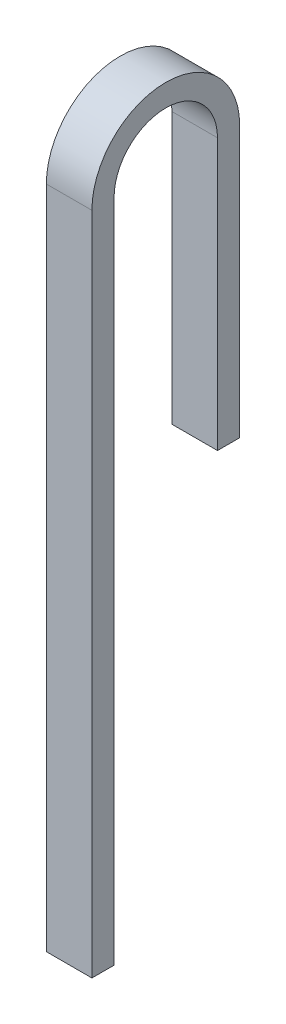
ISO-10303-21;
HEADER;
FILE_DESCRIPTION(('STEP AP214'),'2;1');
FILE_NAME('part.step','',(''),(''),'','','');
FILE_SCHEMA(('AUTOMOTIVE_DESIGN { 1 0 10303 214 1 1 1 1 }'));
ENDSEC;
DATA;
#1=APPLICATION_CONTEXT('core data for automotive mechanical design processes');
#2=APPLICATION_PROTOCOL_DEFINITION('international standard','automotive_design',2000,#1);
#3=PRODUCT_CONTEXT('',#1,'mechanical');
#4=PRODUCT('Part','Part','',(#3));
#5=PRODUCT_RELATED_PRODUCT_CATEGORY('part','',(#4));
#6=PRODUCT_DEFINITION_FORMATION('','',#4);
#7=PRODUCT_DEFINITION_CONTEXT('part definition',#1,'design');
#8=PRODUCT_DEFINITION('design','',#6,#7);
#9=PRODUCT_DEFINITION_SHAPE('','',#8);
#10=(LENGTH_UNIT() NAMED_UNIT(*) SI_UNIT(.MILLI.,.METRE.));
#11=(NAMED_UNIT(*) PLANE_ANGLE_UNIT() SI_UNIT($,.RADIAN.));
#12=(NAMED_UNIT(*) SI_UNIT($,.STERADIAN.) SOLID_ANGLE_UNIT());
#13=UNCERTAINTY_MEASURE_WITH_UNIT(LENGTH_MEASURE(1.E-05),#10,'distance_accuracy_value','');
#14=(GEOMETRIC_REPRESENTATION_CONTEXT(3) GLOBAL_UNCERTAINTY_ASSIGNED_CONTEXT((#13)) GLOBAL_UNIT_ASSIGNED_CONTEXT((#10,
#11,#12)) REPRESENTATION_CONTEXT('',''));
#15=CARTESIAN_POINT('',(0.,0.,0.));
#16=DIRECTION('',(0.,0.,1.));
#17=DIRECTION('',(1.,0.,0.));
#18=AXIS2_PLACEMENT_3D('',#15,#16,#17);
#19=CARTESIAN_POINT('',(18.5,220.,120.));
#20=DIRECTION('',(0.,0.,-1.));
#21=DIRECTION('',(0.,1.,0.));
#22=AXIS2_PLACEMENT_3D('',#19,#20,#21);
#23=PLANE('',#22);
#24=DIRECTION('',(0.,-1.,0.));
#25=VECTOR('',#24,1.);
#26=CARTESIAN_POINT('',(-18.5,220.,120.));
#27=LINE('',#26,#25);
#28=CARTESIAN_POINT('',(-18.5,220.,120.));
#29=VERTEX_POINT('',#28);
#30=CARTESIAN_POINT('',(-18.5,-320.,120.));
#31=VERTEX_POINT('',#30);
#32=EDGE_CURVE('E137',#29,#31,#27,.T.);
#33=ORIENTED_EDGE('',*,*,#32,.T.);
#34=DIRECTION('',(-1.,0.,0.));
#35=VECTOR('',#34,1.);
#36=CARTESIAN_POINT('',(18.5,-320.,120.));
#37=LINE('',#36,#35);
#38=CARTESIAN_POINT('',(18.5,-320.,120.));
#39=VERTEX_POINT('',#38);
#40=EDGE_CURVE('E11',#39,#31,#37,.T.);
#41=ORIENTED_EDGE('',*,*,#40,.F.);
#42=DIRECTION('',(0.,-1.,0.));
#43=VECTOR('',#42,1.);
#44=CARTESIAN_POINT('',(18.5,220.,120.));
#45=LINE('',#44,#43);
#46=CARTESIAN_POINT('',(18.5,220.,120.));
#47=VERTEX_POINT('',#46);
#48=EDGE_CURVE('E97',#47,#39,#45,.T.);
#49=ORIENTED_EDGE('',*,*,#48,.F.);
#50=DIRECTION('',(-1.,0.,0.));
#51=VECTOR('',#50,1.);
#52=CARTESIAN_POINT('',(18.5,220.,120.));
#53=LINE('',#52,#51);
#54=EDGE_CURVE('E139',#47,#29,#53,.T.);
#55=ORIENTED_EDGE('',*,*,#54,.T.);
#56=EDGE_LOOP('',(#33,#41,#49,#55));
#57=FACE_BOUND('',#56,.T.);
#58=ADVANCED_FACE('F41',(#57),#23,.F.);
#59=CARTESIAN_POINT('',(18.5,-320.,102.));
#60=DIRECTION('',(0.,-1.,0.));
#61=DIRECTION('',(0.,0.,-1.));
#62=AXIS2_PLACEMENT_3D('',#59,#60,#61);
#63=PLANE('',#62);
#64=DIRECTION('',(0.,0.,1.));
#65=VECTOR('',#64,1.);
#66=CARTESIAN_POINT('',(-18.5,-320.,102.));
#67=LINE('',#66,#65);
#68=CARTESIAN_POINT('',(-18.5,-320.,102.));
#69=VERTEX_POINT('',#68);
#70=EDGE_CURVE('E142',#69,#31,#67,.T.);
#71=ORIENTED_EDGE('',*,*,#70,.F.);
#72=DIRECTION('',(-1.,0.,0.));
#73=VECTOR('',#72,1.);
#74=CARTESIAN_POINT('',(18.5,-320.,102.));
#75=LINE('',#74,#73);
#76=CARTESIAN_POINT('',(18.5,-320.,102.));
#77=VERTEX_POINT('',#76);
#78=EDGE_CURVE('E47',#77,#69,#75,.T.);
#79=ORIENTED_EDGE('',*,*,#78,.F.);
#80=DIRECTION('',(0.,0.,1.));
#81=VECTOR('',#80,1.);
#82=CARTESIAN_POINT('',(18.5,-320.,102.));
#83=LINE('',#82,#81);
#84=EDGE_CURVE('E176',#77,#39,#83,.T.);
#85=ORIENTED_EDGE('',*,*,#84,.T.);
#86=ORIENTED_EDGE('',*,*,#40,.T.);
#87=EDGE_LOOP('',(#71,#79,#85,#86));
#88=FACE_BOUND('',#87,.T.);
#89=ADVANCED_FACE('F172',(#88),#63,.T.);
#90=CARTESIAN_POINT('',(18.5,220.,102.));
#91=DIRECTION('',(0.,0.,-1.));
#92=DIRECTION('',(0.,1.,0.));
#93=AXIS2_PLACEMENT_3D('',#90,#91,#92);
#94=PLANE('',#93);
#95=DIRECTION('',(0.,-1.,0.));
#96=VECTOR('',#95,1.);
#97=CARTESIAN_POINT('',(-18.5,220.,102.));
#98=LINE('',#97,#96);
#99=CARTESIAN_POINT('',(-18.5,220.,102.));
#100=VERTEX_POINT('',#99);
#101=EDGE_CURVE('E144',#100,#69,#98,.T.);
#102=ORIENTED_EDGE('',*,*,#101,.F.);
#103=DIRECTION('',(-1.,0.,0.));
#104=VECTOR('',#103,1.);
#105=CARTESIAN_POINT('',(18.5,220.,102.));
#106=LINE('',#105,#104);
#107=CARTESIAN_POINT('',(18.5,220.,102.));
#108=VERTEX_POINT('',#107);
#109=EDGE_CURVE('E163',#108,#100,#106,.T.);
#110=ORIENTED_EDGE('',*,*,#109,.F.);
#111=DIRECTION('',(0.,-1.,0.));
#112=VECTOR('',#111,1.);
#113=CARTESIAN_POINT('',(18.5,220.,102.));
#114=LINE('',#113,#112);
#115=EDGE_CURVE('E168',#108,#77,#114,.T.);
#116=ORIENTED_EDGE('',*,*,#115,.T.);
#117=ORIENTED_EDGE('',*,*,#78,.T.);
#118=EDGE_LOOP('',(#102,#110,#116,#117));
#119=FACE_BOUND('',#118,.T.);
#120=ADVANCED_FACE('F167',(#119),#94,.T.);
#121=CARTESIAN_POINT('',(18.5,220.,60.));
#122=DIRECTION('',(-1.,0.,0.));
#123=DIRECTION('',(0.,0.,1.));
#124=AXIS2_PLACEMENT_3D('',#121,#122,#123);
#125=CYLINDRICAL_SURFACE('',#124,42.);
#126=CARTESIAN_POINT('',(-18.5,220.,60.));
#127=DIRECTION('',(1.,0.,0.));
#128=DIRECTION('',(0.,0.,-1.));
#129=AXIS2_PLACEMENT_3D('',#126,#127,#128);
#130=CIRCLE('',#129,42.);
#131=CARTESIAN_POINT('',(-18.5,220.,18.));
#132=VERTEX_POINT('',#131);
#133=EDGE_CURVE('E149',#132,#100,#130,.T.);
#134=ORIENTED_EDGE('',*,*,#133,.F.);
#135=DIRECTION('',(-1.,0.,0.));
#136=VECTOR('',#135,1.);
#137=CARTESIAN_POINT('',(18.5,220.,18.));
#138=LINE('',#137,#136);
#139=CARTESIAN_POINT('',(18.5,220.,18.));
#140=VERTEX_POINT('',#139);
#141=EDGE_CURVE('E159',#140,#132,#138,.T.);
#142=ORIENTED_EDGE('',*,*,#141,.F.);
#143=CARTESIAN_POINT('',(18.5,220.,60.));
#144=DIRECTION('',(1.,0.,0.));
#145=DIRECTION('',(0.,0.,-1.));
#146=AXIS2_PLACEMENT_3D('',#143,#144,#145);
#147=CIRCLE('',#146,42.);
#148=EDGE_CURVE('E135',#140,#108,#147,.T.);
#149=ORIENTED_EDGE('',*,*,#148,.T.);
#150=ORIENTED_EDGE('',*,*,#109,.T.);
#151=EDGE_LOOP('',(#134,#142,#149,#150));
#152=FACE_BOUND('',#151,.T.);
#153=ADVANCED_FACE('F177',(#152),#125,.F.);
#154=CARTESIAN_POINT('',(18.5,0.,18.));
#155=DIRECTION('',(0.,0.,1.));
#156=DIRECTION('',(1.,0.,0.));
#157=AXIS2_PLACEMENT_3D('',#154,#155,#156);
#158=PLANE('',#157);
#159=DIRECTION('',(0.,1.,0.));
#160=VECTOR('',#159,1.);
#161=CARTESIAN_POINT('',(-18.5,0.,18.));
#162=LINE('',#161,#160);
#163=CARTESIAN_POINT('',(-18.5,0.,18.));
#164=VERTEX_POINT('',#163);
#165=EDGE_CURVE('E148',#164,#132,#162,.T.);
#166=ORIENTED_EDGE('',*,*,#165,.F.);
#167=DIRECTION('',(-1.,0.,0.));
#168=VECTOR('',#167,1.);
#169=CARTESIAN_POINT('',(18.5,0.,18.));
#170=LINE('',#169,#168);
#171=CARTESIAN_POINT('',(18.5,0.,18.));
#172=VERTEX_POINT('',#171);
#173=EDGE_CURVE('E119',#172,#164,#170,.T.);
#174=ORIENTED_EDGE('',*,*,#173,.F.);
#175=DIRECTION('',(0.,1.,0.));
#176=VECTOR('',#175,1.);
#177=CARTESIAN_POINT('',(18.5,0.,18.));
#178=LINE('',#177,#176);
#179=EDGE_CURVE('E129',#172,#140,#178,.T.);
#180=ORIENTED_EDGE('',*,*,#179,.T.);
#181=ORIENTED_EDGE('',*,*,#141,.T.);
#182=EDGE_LOOP('',(#166,#174,#180,#181));
#183=FACE_BOUND('',#182,.T.);
#184=ADVANCED_FACE('F184',(#183),#158,.T.);
#185=CARTESIAN_POINT('',(18.5,0.,0.));
#186=DIRECTION('',(0.,-1.,0.));
#187=DIRECTION('',(0.,0.,-1.));
#188=AXIS2_PLACEMENT_3D('',#185,#186,#187);
#189=PLANE('',#188);
#190=DIRECTION('',(0.,0.,1.));
#191=VECTOR('',#190,1.);
#192=CARTESIAN_POINT('',(-18.5,0.,0.));
#193=LINE('',#192,#191);
#194=CARTESIAN_POINT('',(-18.5,0.,0.));
#195=VERTEX_POINT('',#194);
#196=EDGE_CURVE('E117',#195,#164,#193,.T.);
#197=ORIENTED_EDGE('',*,*,#196,.F.);
#198=DIRECTION('',(-1.,0.,0.));
#199=VECTOR('',#198,1.);
#200=CARTESIAN_POINT('',(18.5,0.,0.));
#201=LINE('',#200,#199);
#202=CARTESIAN_POINT('',(18.5,0.,0.));
#203=VERTEX_POINT('',#202);
#204=EDGE_CURVE('E111',#203,#195,#201,.T.);
#205=ORIENTED_EDGE('',*,*,#204,.F.);
#206=DIRECTION('',(0.,0.,1.));
#207=VECTOR('',#206,1.);
#208=CARTESIAN_POINT('',(18.5,0.,0.));
#209=LINE('',#208,#207);
#210=EDGE_CURVE('E120',#203,#172,#209,.T.);
#211=ORIENTED_EDGE('',*,*,#210,.T.);
#212=ORIENTED_EDGE('',*,*,#173,.T.);
#213=EDGE_LOOP('',(#197,#205,#211,#212));
#214=FACE_BOUND('',#213,.T.);
#215=ADVANCED_FACE('F112',(#214),#189,.T.);
#216=CARTESIAN_POINT('',(18.5,0.,0.));
#217=DIRECTION('',(0.,0.,1.));
#218=DIRECTION('',(1.,0.,0.));
#219=AXIS2_PLACEMENT_3D('',#216,#217,#218);
#220=PLANE('',#219);
#221=DIRECTION('',(0.,1.,0.));
#222=VECTOR('',#221,1.);
#223=CARTESIAN_POINT('',(-18.5,0.,0.));
#224=LINE('',#223,#222);
#225=CARTESIAN_POINT('',(-18.5,220.,0.));
#226=VERTEX_POINT('',#225);
#227=EDGE_CURVE('E84',#195,#226,#224,.T.);
#228=ORIENTED_EDGE('',*,*,#227,.T.);
#229=DIRECTION('',(-1.,0.,0.));
#230=VECTOR('',#229,1.);
#231=CARTESIAN_POINT('',(18.5,220.,0.));
#232=LINE('',#231,#230);
#233=CARTESIAN_POINT('',(18.5,220.,0.));
#234=VERTEX_POINT('',#233);
#235=EDGE_CURVE('E121',#234,#226,#232,.T.);
#236=ORIENTED_EDGE('',*,*,#235,.F.);
#237=DIRECTION('',(0.,1.,0.));
#238=VECTOR('',#237,1.);
#239=CARTESIAN_POINT('',(18.5,0.,0.));
#240=LINE('',#239,#238);
#241=EDGE_CURVE('E123',#203,#234,#240,.T.);
#242=ORIENTED_EDGE('',*,*,#241,.F.);
#243=ORIENTED_EDGE('',*,*,#204,.T.);
#244=EDGE_LOOP('',(#228,#236,#242,#243));
#245=FACE_BOUND('',#244,.T.);
#246=ADVANCED_FACE('F122',(#245),#220,.F.);
#247=CARTESIAN_POINT('',(18.5,220.,60.));
#248=DIRECTION('',(-1.,0.,0.));
#249=DIRECTION('',(0.,0.,1.));
#250=AXIS2_PLACEMENT_3D('',#247,#248,#249);
#251=CYLINDRICAL_SURFACE('',#250,60.);
#252=CARTESIAN_POINT('',(-18.5,220.,60.));
#253=DIRECTION('',(1.,0.,0.));
#254=DIRECTION('',(0.,0.,-1.));
#255=AXIS2_PLACEMENT_3D('',#252,#253,#254);
#256=CIRCLE('',#255,60.);
#257=EDGE_CURVE('E86',#226,#29,#256,.T.);
#258=ORIENTED_EDGE('',*,*,#257,.T.);
#259=ORIENTED_EDGE('',*,*,#54,.F.);
#260=CARTESIAN_POINT('',(18.5,220.,60.));
#261=DIRECTION('',(1.,0.,0.));
#262=DIRECTION('',(0.,0.,-1.));
#263=AXIS2_PLACEMENT_3D('',#260,#261,#262);
#264=CIRCLE('',#263,60.);
#265=EDGE_CURVE('E60',#234,#47,#264,.T.);
#266=ORIENTED_EDGE('',*,*,#265,.F.);
#267=ORIENTED_EDGE('',*,*,#235,.T.);
#268=EDGE_LOOP('',(#258,#259,#266,#267));
#269=FACE_BOUND('',#268,.T.);
#270=ADVANCED_FACE('F190',(#269),#251,.T.);
#271=CARTESIAN_POINT('',(18.5,220.,60.));
#272=DIRECTION('',(1.,0.,0.));
#273=DIRECTION('',(0.,0.,-1.));
#274=AXIS2_PLACEMENT_3D('',#271,#272,#273);
#275=PLANE('',#274);
#276=ORIENTED_EDGE('',*,*,#48,.T.);
#277=ORIENTED_EDGE('',*,*,#84,.F.);
#278=ORIENTED_EDGE('',*,*,#115,.F.);
#279=ORIENTED_EDGE('',*,*,#148,.F.);
#280=ORIENTED_EDGE('',*,*,#179,.F.);
#281=ORIENTED_EDGE('',*,*,#210,.F.);
#282=ORIENTED_EDGE('',*,*,#241,.T.);
#283=ORIENTED_EDGE('',*,*,#265,.T.);
#284=EDGE_LOOP('',(#276,#277,#278,#279,#280,#281,#282,#283));
#285=FACE_BOUND('',#284,.T.);
#286=ADVANCED_FACE('F130',(#285),#275,.T.);
#287=CARTESIAN_POINT('',(-18.5,220.,60.));
#288=DIRECTION('',(1.,0.,0.));
#289=DIRECTION('',(0.,0.,-1.));
#290=AXIS2_PLACEMENT_3D('',#287,#288,#289);
#291=PLANE('',#290);
#292=ORIENTED_EDGE('',*,*,#32,.F.);
#293=ORIENTED_EDGE('',*,*,#257,.F.);
#294=ORIENTED_EDGE('',*,*,#227,.F.);
#295=ORIENTED_EDGE('',*,*,#196,.T.);
#296=ORIENTED_EDGE('',*,*,#165,.T.);
#297=ORIENTED_EDGE('',*,*,#133,.T.);
#298=ORIENTED_EDGE('',*,*,#101,.T.);
#299=ORIENTED_EDGE('',*,*,#70,.T.);
#300=EDGE_LOOP('',(#292,#293,#294,#295,#296,#297,#298,#299));
#301=FACE_BOUND('',#300,.T.);
#302=ADVANCED_FACE('F171',(#301),#291,.F.);
#303=CLOSED_SHELL('',(#58,#89,#120,#153,#184,#215,#246,#270,#286,#302));
#304=MANIFOLD_SOLID_BREP('B2',#303);
#305=ADVANCED_BREP_SHAPE_REPRESENTATION('',(#18,#304),#14);
#306=SHAPE_DEFINITION_REPRESENTATION(#9,#305);
ENDSEC;
END-ISO-10303-21;
